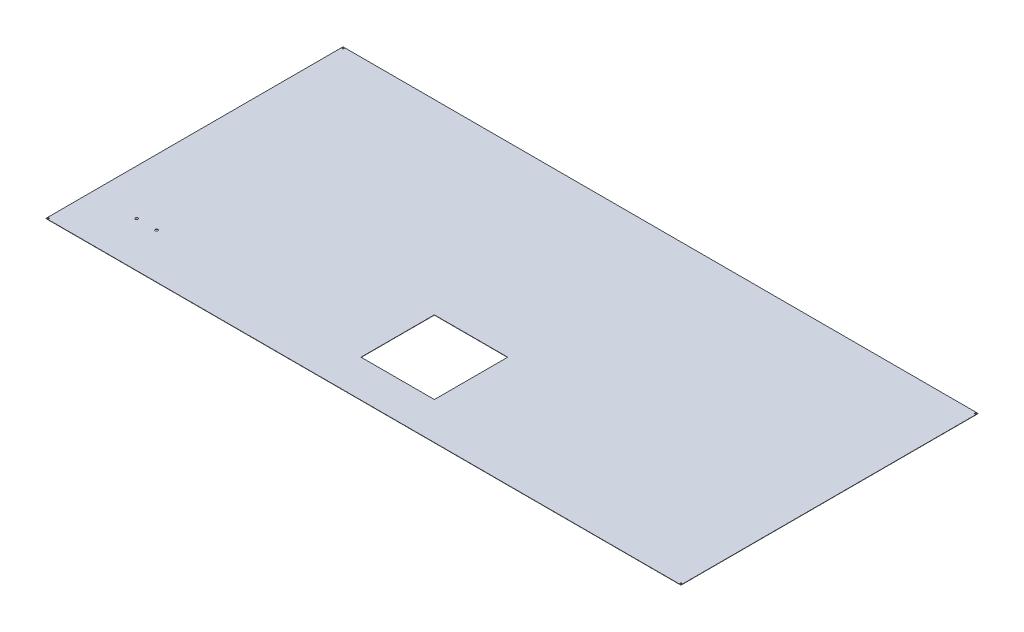
ISO-10303-21;
HEADER;
FILE_DESCRIPTION(('STEP AP214'),'2;1');
FILE_NAME('part.step','',(''),(''),'','','');
FILE_SCHEMA(('AUTOMOTIVE_DESIGN { 1 0 10303 214 1 1 1 1 }'));
ENDSEC;
DATA;
#1=APPLICATION_CONTEXT('core data for automotive mechanical design processes');
#2=APPLICATION_PROTOCOL_DEFINITION('international standard','automotive_design',2000,#1);
#3=PRODUCT_CONTEXT('',#1,'mechanical');
#4=PRODUCT('Part','Part','',(#3));
#5=PRODUCT_RELATED_PRODUCT_CATEGORY('part','',(#4));
#6=PRODUCT_DEFINITION_FORMATION('','',#4);
#7=PRODUCT_DEFINITION_CONTEXT('part definition',#1,'design');
#8=PRODUCT_DEFINITION('design','',#6,#7);
#9=PRODUCT_DEFINITION_SHAPE('','',#8);
#10=(LENGTH_UNIT() NAMED_UNIT(*) SI_UNIT(.MILLI.,.METRE.));
#11=(NAMED_UNIT(*) PLANE_ANGLE_UNIT() SI_UNIT($,.RADIAN.));
#12=(NAMED_UNIT(*) SI_UNIT($,.STERADIAN.) SOLID_ANGLE_UNIT());
#13=UNCERTAINTY_MEASURE_WITH_UNIT(LENGTH_MEASURE(1.E-05),#10,'distance_accuracy_value','');
#14=(GEOMETRIC_REPRESENTATION_CONTEXT(3) GLOBAL_UNCERTAINTY_ASSIGNED_CONTEXT((#13)) GLOBAL_UNIT_ASSIGNED_CONTEXT((#10,
#11,#12)) REPRESENTATION_CONTEXT('',''));
#15=CARTESIAN_POINT('',(0.,0.,0.));
#16=DIRECTION('',(0.,0.,1.));
#17=DIRECTION('',(1.,0.,0.));
#18=AXIS2_PLACEMENT_3D('',#15,#16,#17);
#19=CARTESIAN_POINT('',(689.999999996567,0.499999999999945,-1012.5));
#20=DIRECTION('',(1.,0.,0.));
#21=DIRECTION('',(0.,0.,-1.));
#22=AXIS2_PLACEMENT_3D('',#19,#20,#21);
#23=PLANE('',#22);
#24=DIRECTION('',(0.,0.,1.));
#25=VECTOR('',#24,1.);
#26=CARTESIAN_POINT('',(689.999999996567,0.,-1012.5));
#27=LINE('',#26,#25);
#28=CARTESIAN_POINT('',(689.999999996568,0.,-1579.5));
#29=VERTEX_POINT('',#28);
#30=CARTESIAN_POINT('',(689.999999996567,0.,-1012.5));
#31=VERTEX_POINT('',#30);
#32=EDGE_CURVE('E166',#29,#31,#27,.T.);
#33=ORIENTED_EDGE('',*,*,#32,.T.);
#34=DIRECTION('',(0.,-1.,0.));
#35=VECTOR('',#34,1.);
#36=CARTESIAN_POINT('',(689.999999996567,0.499999999999945,-1012.5));
#37=LINE('',#36,#35);
#38=CARTESIAN_POINT('',(689.999999996567,0.499999999999945,-1012.5));
#39=VERTEX_POINT('',#38);
#40=EDGE_CURVE('E182',#39,#31,#37,.T.);
#41=ORIENTED_EDGE('',*,*,#40,.F.);
#42=DIRECTION('',(0.,0.,1.));
#43=VECTOR('',#42,1.);
#44=CARTESIAN_POINT('',(689.999999996567,0.499999999999945,-1012.5));
#45=LINE('',#44,#43);
#46=CARTESIAN_POINT('',(689.999999996568,0.499999999999945,-1579.5));
#47=VERTEX_POINT('',#46);
#48=EDGE_CURVE('E155',#47,#39,#45,.T.);
#49=ORIENTED_EDGE('',*,*,#48,.F.);
#50=DIRECTION('',(0.,-1.,0.));
#51=VECTOR('',#50,1.);
#52=CARTESIAN_POINT('',(689.999999996568,0.499999999999945,-1579.5));
#53=LINE('',#52,#51);
#54=EDGE_CURVE('E165',#47,#29,#53,.T.);
#55=ORIENTED_EDGE('',*,*,#54,.T.);
#56=EDGE_LOOP('',(#33,#41,#49,#55));
#57=FACE_BOUND('',#56,.T.);
#58=ADVANCED_FACE('F39',(#57),#23,.F.);
#59=CARTESIAN_POINT('',(1901.99999999657,0.499999999999945,-1012.5));
#60=DIRECTION('',(0.,0.,-1.));
#61=DIRECTION('',(-1.,0.,0.));
#62=AXIS2_PLACEMENT_3D('',#59,#60,#61);
#63=PLANE('',#62);
#64=DIRECTION('',(1.,0.,0.));
#65=VECTOR('',#64,1.);
#66=CARTESIAN_POINT('',(1901.99999999657,0.,-1012.5));
#67=LINE('',#66,#65);
#68=CARTESIAN_POINT('',(1901.99999999657,0.,-1012.5));
#69=VERTEX_POINT('',#68);
#70=EDGE_CURVE('E169',#31,#69,#67,.T.);
#71=ORIENTED_EDGE('',*,*,#70,.T.);
#72=DIRECTION('',(0.,-1.,0.));
#73=VECTOR('',#72,1.);
#74=CARTESIAN_POINT('',(1901.99999999657,0.499999999999945,-1012.5));
#75=LINE('',#74,#73);
#76=CARTESIAN_POINT('',(1901.99999999657,0.499999999999945,-1012.5));
#77=VERTEX_POINT('',#76);
#78=EDGE_CURVE('E179',#77,#69,#75,.T.);
#79=ORIENTED_EDGE('',*,*,#78,.F.);
#80=DIRECTION('',(1.,0.,0.));
#81=VECTOR('',#80,1.);
#82=CARTESIAN_POINT('',(1901.99999999657,0.499999999999945,-1012.5));
#83=LINE('',#82,#81);
#84=EDGE_CURVE('E158',#39,#77,#83,.T.);
#85=ORIENTED_EDGE('',*,*,#84,.F.);
#86=ORIENTED_EDGE('',*,*,#40,.T.);
#87=EDGE_LOOP('',(#71,#79,#85,#86));
#88=FACE_BOUND('',#87,.T.);
#89=ADVANCED_FACE('F221',(#88),#63,.F.);
#90=CARTESIAN_POINT('',(1901.99999999657,0.499999999999945,-1012.5));
#91=DIRECTION('',(-1.,0.,0.));
#92=DIRECTION('',(0.,0.,1.));
#93=AXIS2_PLACEMENT_3D('',#90,#91,#92);
#94=PLANE('',#93);
#95=DIRECTION('',(0.,0.,-1.));
#96=VECTOR('',#95,1.);
#97=CARTESIAN_POINT('',(1901.99999999657,0.,-1012.5));
#98=LINE('',#97,#96);
#99=CARTESIAN_POINT('',(1901.99999999657,0.,-1579.5));
#100=VERTEX_POINT('',#99);
#101=EDGE_CURVE('E171',#69,#100,#98,.T.);
#102=ORIENTED_EDGE('',*,*,#101,.T.);
#103=DIRECTION('',(0.,-1.,0.));
#104=VECTOR('',#103,1.);
#105=CARTESIAN_POINT('',(1901.99999999657,0.499999999999945,-1579.5));
#106=LINE('',#105,#104);
#107=CARTESIAN_POINT('',(1901.99999999657,0.499999999999945,-1579.5));
#108=VERTEX_POINT('',#107);
#109=EDGE_CURVE('E176',#108,#100,#106,.T.);
#110=ORIENTED_EDGE('',*,*,#109,.F.);
#111=DIRECTION('',(0.,0.,-1.));
#112=VECTOR('',#111,1.);
#113=CARTESIAN_POINT('',(1901.99999999657,0.499999999999945,-1012.5));
#114=LINE('',#113,#112);
#115=EDGE_CURVE('E161',#77,#108,#114,.T.);
#116=ORIENTED_EDGE('',*,*,#115,.F.);
#117=ORIENTED_EDGE('',*,*,#78,.T.);
#118=EDGE_LOOP('',(#102,#110,#116,#117));
#119=FACE_BOUND('',#118,.T.);
#120=ADVANCED_FACE('F227',(#119),#94,.F.);
#121=CARTESIAN_POINT('',(1901.99999999657,0.499999999999945,-1579.5));
#122=DIRECTION('',(0.,0.,1.));
#123=DIRECTION('',(1.,0.,0.));
#124=AXIS2_PLACEMENT_3D('',#121,#122,#123);
#125=PLANE('',#124);
#126=DIRECTION('',(-1.,0.,0.));
#127=VECTOR('',#126,1.);
#128=CARTESIAN_POINT('',(1901.99999999657,0.,-1579.5));
#129=LINE('',#128,#127);
#130=EDGE_CURVE('E159',#100,#29,#129,.T.);
#131=ORIENTED_EDGE('',*,*,#130,.T.);
#132=ORIENTED_EDGE('',*,*,#54,.F.);
#133=DIRECTION('',(-1.,0.,0.));
#134=VECTOR('',#133,1.);
#135=CARTESIAN_POINT('',(1901.99999999657,0.499999999999945,-1579.5));
#136=LINE('',#135,#134);
#137=EDGE_CURVE('E163',#108,#47,#136,.T.);
#138=ORIENTED_EDGE('',*,*,#137,.F.);
#139=ORIENTED_EDGE('',*,*,#109,.T.);
#140=EDGE_LOOP('',(#131,#132,#138,#139));
#141=FACE_BOUND('',#140,.T.);
#142=ADVANCED_FACE('F242',(#141),#125,.F.);
#143=CARTESIAN_POINT('',(0.,0.499999999999945,0.));
#144=DIRECTION('',(0.,1.,0.));
#145=DIRECTION('',(0.,0.,1.));
#146=AXIS2_PLACEMENT_3D('',#143,#144,#145);
#147=PLANE('',#146);
#148=DIRECTION('',(0.,0.,1.));
#149=VECTOR('',#148,1.);
#150=CARTESIAN_POINT('',(1220.24360836821,0.499999999999945,-1223.58));
#151=LINE('',#150,#149);
#152=CARTESIAN_POINT('',(1220.24360836821,0.499999999999945,-1223.58));
#153=VERTEX_POINT('',#152);
#154=CARTESIAN_POINT('',(1220.24360836821,0.499999999999945,-1083.58));
#155=VERTEX_POINT('',#154);
#156=EDGE_CURVE('E53',#153,#155,#151,.T.);
#157=ORIENTED_EDGE('',*,*,#156,.F.);
#158=DIRECTION('',(-1.,0.,0.));
#159=VECTOR('',#158,1.);
#160=CARTESIAN_POINT('',(1220.24360836821,0.499999999999945,-1223.58));
#161=LINE('',#160,#159);
#162=CARTESIAN_POINT('',(1360.24360836821,0.499999999999945,-1223.58));
#163=VERTEX_POINT('',#162);
#164=EDGE_CURVE('E122',#163,#153,#161,.T.);
#165=ORIENTED_EDGE('',*,*,#164,.F.);
#166=DIRECTION('',(0.,0.,-1.));
#167=VECTOR('',#166,1.);
#168=CARTESIAN_POINT('',(1360.24360836821,0.499999999999945,-1223.58));
#169=LINE('',#168,#167);
#170=CARTESIAN_POINT('',(1360.24360836821,0.499999999999945,-1083.58));
#171=VERTEX_POINT('',#170);
#172=EDGE_CURVE('E106',#171,#163,#169,.T.);
#173=ORIENTED_EDGE('',*,*,#172,.F.);
#174=DIRECTION('',(1.,0.,0.));
#175=VECTOR('',#174,1.);
#176=CARTESIAN_POINT('',(1220.24360836821,0.499999999999945,-1083.58));
#177=LINE('',#176,#175);
#178=EDGE_CURVE('E115',#155,#171,#177,.T.);
#179=ORIENTED_EDGE('',*,*,#178,.F.);
#180=EDGE_LOOP('',(#157,#165,#173,#179));
#181=FACE_BOUND('',#180,.T.);
#182=CARTESIAN_POINT('',(776.999999996553,0.499999999999945,-1098.50000000001));
#183=DIRECTION('',(0.,1.,0.));
#184=DIRECTION('',(0.,0.,1.));
#185=AXIS2_PLACEMENT_3D('',#182,#183,#184);
#186=CIRCLE('',#185,2.50000000000005);
#187=CARTESIAN_POINT('',(776.999999996553,0.499999999999945,-1096.00000000001));
#188=VERTEX_POINT('',#187);
#189=EDGE_CURVE('E132',#188,#188,#186,.T.);
#190=ORIENTED_EDGE('',*,*,#189,.F.);
#191=EDGE_LOOP('',(#190));
#192=FACE_BOUND('',#191,.T.);
#193=CARTESIAN_POINT('',(814.999999996553,0.499999999999945,-1098.50000000001));
#194=DIRECTION('',(0.,1.,0.));
#195=DIRECTION('',(0.,0.,1.));
#196=AXIS2_PLACEMENT_3D('',#193,#194,#195);
#197=CIRCLE('',#196,2.50000000000005);
#198=CARTESIAN_POINT('',(814.999999996553,0.499999999999945,-1096.00000000001));
#199=VERTEX_POINT('',#198);
#200=EDGE_CURVE('E129',#199,#199,#197,.T.);
#201=ORIENTED_EDGE('',*,*,#200,.F.);
#202=EDGE_LOOP('',(#201));
#203=FACE_BOUND('',#202,.T.);
#204=CARTESIAN_POINT('',(691.999999996568,0.499999999999945,-1577.5));
#205=DIRECTION('',(0.,1.,0.));
#206=DIRECTION('',(0.,0.,1.));
#207=AXIS2_PLACEMENT_3D('',#204,#205,#206);
#208=CIRCLE('',#207,1.80000000000002);
#209=CARTESIAN_POINT('',(691.999999996568,0.499999999999945,-1575.7));
#210=VERTEX_POINT('',#209);
#211=EDGE_CURVE('E138',#210,#210,#208,.T.);
#212=ORIENTED_EDGE('',*,*,#211,.F.);
#213=EDGE_LOOP('',(#212));
#214=FACE_BOUND('',#213,.T.);
#215=CARTESIAN_POINT('',(691.999999996568,0.499999999999945,-1014.5));
#216=DIRECTION('',(0.,1.,0.));
#217=DIRECTION('',(0.,0.,1.));
#218=AXIS2_PLACEMENT_3D('',#215,#216,#217);
#219=CIRCLE('',#218,1.80000000000002);
#220=CARTESIAN_POINT('',(691.999999996568,0.499999999999945,-1012.7));
#221=VERTEX_POINT('',#220);
#222=EDGE_CURVE('E143',#221,#221,#219,.T.);
#223=ORIENTED_EDGE('',*,*,#222,.F.);
#224=EDGE_LOOP('',(#223));
#225=FACE_BOUND('',#224,.T.);
#226=CARTESIAN_POINT('',(1899.99999999657,0.499999999999945,-1014.5));
#227=DIRECTION('',(0.,1.,0.));
#228=DIRECTION('',(0.,0.,1.));
#229=AXIS2_PLACEMENT_3D('',#226,#227,#228);
#230=CIRCLE('',#229,1.80000000000002);
#231=CARTESIAN_POINT('',(1899.99999999657,0.499999999999945,-1012.7));
#232=VERTEX_POINT('',#231);
#233=EDGE_CURVE('E147',#232,#232,#230,.T.);
#234=ORIENTED_EDGE('',*,*,#233,.F.);
#235=EDGE_LOOP('',(#234));
#236=FACE_BOUND('',#235,.T.);
#237=CARTESIAN_POINT('',(1899.99999999657,0.499999999999945,-1577.5));
#238=DIRECTION('',(0.,1.,0.));
#239=DIRECTION('',(0.,0.,1.));
#240=AXIS2_PLACEMENT_3D('',#237,#238,#239);
#241=CIRCLE('',#240,1.80000000000002);
#242=CARTESIAN_POINT('',(1899.99999999657,0.499999999999945,-1575.7));
#243=VERTEX_POINT('',#242);
#244=EDGE_CURVE('E151',#243,#243,#241,.T.);
#245=ORIENTED_EDGE('',*,*,#244,.F.);
#246=EDGE_LOOP('',(#245));
#247=FACE_BOUND('',#246,.T.);
#248=ORIENTED_EDGE('',*,*,#48,.T.);
#249=ORIENTED_EDGE('',*,*,#84,.T.);
#250=ORIENTED_EDGE('',*,*,#115,.T.);
#251=ORIENTED_EDGE('',*,*,#137,.T.);
#252=EDGE_LOOP('',(#248,#249,#250,#251));
#253=FACE_BOUND('',#252,.T.);
#254=ADVANCED_FACE('F119',(#181,#192,#203,#214,#225,#236,#247,#253),#147,.T.);
#255=CARTESIAN_POINT('',(0.,0.,0.));
#256=DIRECTION('',(0.,1.,0.));
#257=DIRECTION('',(0.,0.,1.));
#258=AXIS2_PLACEMENT_3D('',#255,#256,#257);
#259=PLANE('',#258);
#260=DIRECTION('',(-1.,0.,0.));
#261=VECTOR('',#260,1.);
#262=CARTESIAN_POINT('',(0.,0.,-1223.58));
#263=LINE('',#262,#261);
#264=CARTESIAN_POINT('',(1360.24360836821,0.,-1223.58));
#265=VERTEX_POINT('',#264);
#266=CARTESIAN_POINT('',(1220.24360836821,0.,-1223.58));
#267=VERTEX_POINT('',#266);
#268=EDGE_CURVE('E46',#265,#267,#263,.T.);
#269=ORIENTED_EDGE('',*,*,#268,.T.);
#270=DIRECTION('',(0.,0.,1.));
#271=VECTOR('',#270,1.);
#272=CARTESIAN_POINT('',(1220.24360836821,0.,0.));
#273=LINE('',#272,#271);
#274=CARTESIAN_POINT('',(1220.24360836821,0.,-1083.58));
#275=VERTEX_POINT('',#274);
#276=EDGE_CURVE('E11',#267,#275,#273,.T.);
#277=ORIENTED_EDGE('',*,*,#276,.T.);
#278=DIRECTION('',(1.,0.,0.));
#279=VECTOR('',#278,1.);
#280=CARTESIAN_POINT('',(0.,0.,-1083.58));
#281=LINE('',#280,#279);
#282=CARTESIAN_POINT('',(1360.24360836821,0.,-1083.58));
#283=VERTEX_POINT('',#282);
#284=EDGE_CURVE('E185',#275,#283,#281,.T.);
#285=ORIENTED_EDGE('',*,*,#284,.T.);
#286=DIRECTION('',(0.,0.,-1.));
#287=VECTOR('',#286,1.);
#288=CARTESIAN_POINT('',(1360.24360836821,0.,2.22044604925031E-12));
#289=LINE('',#288,#287);
#290=EDGE_CURVE('E109',#283,#265,#289,.T.);
#291=ORIENTED_EDGE('',*,*,#290,.T.);
#292=EDGE_LOOP('',(#269,#277,#285,#291));
#293=FACE_BOUND('',#292,.T.);
#294=CARTESIAN_POINT('',(776.999999996553,0.,-1098.50000000001));
#295=DIRECTION('',(0.,1.,0.));
#296=DIRECTION('',(0.,0.,1.));
#297=AXIS2_PLACEMENT_3D('',#294,#295,#296);
#298=CIRCLE('',#297,2.50000000000005);
#299=CARTESIAN_POINT('',(776.999999996553,0.,-1096.00000000001));
#300=VERTEX_POINT('',#299);
#301=EDGE_CURVE('E142',#300,#300,#298,.T.);
#302=ORIENTED_EDGE('',*,*,#301,.T.);
#303=EDGE_LOOP('',(#302));
#304=FACE_BOUND('',#303,.T.);
#305=CARTESIAN_POINT('',(814.999999996553,0.,-1098.50000000001));
#306=DIRECTION('',(0.,1.,0.));
#307=DIRECTION('',(0.,0.,1.));
#308=AXIS2_PLACEMENT_3D('',#305,#306,#307);
#309=CIRCLE('',#308,2.50000000000005);
#310=CARTESIAN_POINT('',(814.999999996553,0.,-1096.00000000001));
#311=VERTEX_POINT('',#310);
#312=EDGE_CURVE('E135',#311,#311,#309,.T.);
#313=ORIENTED_EDGE('',*,*,#312,.T.);
#314=EDGE_LOOP('',(#313));
#315=FACE_BOUND('',#314,.T.);
#316=CARTESIAN_POINT('',(691.999999996568,0.,-1577.5));
#317=DIRECTION('',(0.,1.,0.));
#318=DIRECTION('',(0.,0.,1.));
#319=AXIS2_PLACEMENT_3D('',#316,#317,#318);
#320=CIRCLE('',#319,1.30000000000002);
#321=CARTESIAN_POINT('',(691.999999996568,0.,-1576.2));
#322=VERTEX_POINT('',#321);
#323=EDGE_CURVE('E141',#322,#322,#320,.T.);
#324=ORIENTED_EDGE('',*,*,#323,.T.);
#325=EDGE_LOOP('',(#324));
#326=FACE_BOUND('',#325,.T.);
#327=CARTESIAN_POINT('',(691.999999996568,0.,-1014.5));
#328=DIRECTION('',(0.,1.,0.));
#329=DIRECTION('',(0.,0.,1.));
#330=AXIS2_PLACEMENT_3D('',#327,#328,#329);
#331=CIRCLE('',#330,1.30000000000002);
#332=CARTESIAN_POINT('',(691.999999996568,0.,-1013.2));
#333=VERTEX_POINT('',#332);
#334=EDGE_CURVE('E146',#333,#333,#331,.T.);
#335=ORIENTED_EDGE('',*,*,#334,.T.);
#336=EDGE_LOOP('',(#335));
#337=FACE_BOUND('',#336,.T.);
#338=CARTESIAN_POINT('',(1899.99999999657,0.,-1014.5));
#339=DIRECTION('',(0.,1.,0.));
#340=DIRECTION('',(0.,0.,1.));
#341=AXIS2_PLACEMENT_3D('',#338,#339,#340);
#342=CIRCLE('',#341,1.29999999999996);
#343=CARTESIAN_POINT('',(1899.99999999657,0.,-1013.2));
#344=VERTEX_POINT('',#343);
#345=EDGE_CURVE('E150',#344,#344,#342,.T.);
#346=ORIENTED_EDGE('',*,*,#345,.T.);
#347=EDGE_LOOP('',(#346));
#348=FACE_BOUND('',#347,.T.);
#349=CARTESIAN_POINT('',(1899.99999999657,0.,-1577.5));
#350=DIRECTION('',(0.,1.,0.));
#351=DIRECTION('',(0.,0.,1.));
#352=AXIS2_PLACEMENT_3D('',#349,#350,#351);
#353=CIRCLE('',#352,1.29999999999996);
#354=CARTESIAN_POINT('',(1899.99999999657,0.,-1576.2));
#355=VERTEX_POINT('',#354);
#356=EDGE_CURVE('E154',#355,#355,#353,.T.);
#357=ORIENTED_EDGE('',*,*,#356,.T.);
#358=EDGE_LOOP('',(#357));
#359=FACE_BOUND('',#358,.T.);
#360=ORIENTED_EDGE('',*,*,#32,.F.);
#361=ORIENTED_EDGE('',*,*,#130,.F.);
#362=ORIENTED_EDGE('',*,*,#101,.F.);
#363=ORIENTED_EDGE('',*,*,#70,.F.);
#364=EDGE_LOOP('',(#360,#361,#362,#363));
#365=FACE_BOUND('',#364,.T.);
#366=ADVANCED_FACE('F201',(#293,#304,#315,#326,#337,#348,#359,#365),#259,.F.);
#367=CARTESIAN_POINT('',(1899.99999999657,0.499999999999945,-1577.5));
#368=DIRECTION('',(0.,1.,0.));
#369=DIRECTION('',(0.,0.,1.));
#370=AXIS2_PLACEMENT_3D('',#367,#368,#369);
#371=CONICAL_SURFACE('',#370,1.80000000000002,0.785398163397514);
#372=ORIENTED_EDGE('',*,*,#244,.T.);
#373=EDGE_LOOP('',(#372));
#374=FACE_BOUND('',#373,.T.);
#375=ORIENTED_EDGE('',*,*,#356,.F.);
#376=EDGE_LOOP('',(#375));
#377=FACE_BOUND('',#376,.T.);
#378=ADVANCED_FACE('F254',(#374,#377),#371,.F.);
#379=CARTESIAN_POINT('',(1899.99999999657,0.499999999999945,-1014.5));
#380=DIRECTION('',(0.,1.,0.));
#381=DIRECTION('',(0.,0.,1.));
#382=AXIS2_PLACEMENT_3D('',#379,#380,#381);
#383=CONICAL_SURFACE('',#382,1.80000000000002,0.785398163397514);
#384=ORIENTED_EDGE('',*,*,#233,.T.);
#385=EDGE_LOOP('',(#384));
#386=FACE_BOUND('',#385,.T.);
#387=ORIENTED_EDGE('',*,*,#345,.F.);
#388=EDGE_LOOP('',(#387));
#389=FACE_BOUND('',#388,.T.);
#390=ADVANCED_FACE('F259',(#386,#389),#383,.F.);
#391=CARTESIAN_POINT('',(691.999999996568,0.499999999999945,-1014.5));
#392=DIRECTION('',(0.,1.,0.));
#393=DIRECTION('',(0.,0.,1.));
#394=AXIS2_PLACEMENT_3D('',#391,#392,#393);
#395=CONICAL_SURFACE('',#394,1.80000000000002,0.785398163397452);
#396=ORIENTED_EDGE('',*,*,#222,.T.);
#397=EDGE_LOOP('',(#396));
#398=FACE_BOUND('',#397,.T.);
#399=ORIENTED_EDGE('',*,*,#334,.F.);
#400=EDGE_LOOP('',(#399));
#401=FACE_BOUND('',#400,.T.);
#402=ADVANCED_FACE('F263',(#398,#401),#395,.F.);
#403=CARTESIAN_POINT('',(691.999999996568,0.499999999999945,-1577.5));
#404=DIRECTION('',(0.,1.,0.));
#405=DIRECTION('',(0.,0.,1.));
#406=AXIS2_PLACEMENT_3D('',#403,#404,#405);
#407=CONICAL_SURFACE('',#406,1.80000000000002,0.785398163397452);
#408=ORIENTED_EDGE('',*,*,#211,.T.);
#409=EDGE_LOOP('',(#408));
#410=FACE_BOUND('',#409,.T.);
#411=ORIENTED_EDGE('',*,*,#323,.F.);
#412=EDGE_LOOP('',(#411));
#413=FACE_BOUND('',#412,.T.);
#414=ADVANCED_FACE('F267',(#410,#413),#407,.F.);
#415=CARTESIAN_POINT('',(814.999999996553,-2.49999999999995,-1098.50000000001));
#416=DIRECTION('',(0.,1.,0.));
#417=DIRECTION('',(0.,0.,1.));
#418=AXIS2_PLACEMENT_3D('',#415,#416,#417);
#419=CYLINDRICAL_SURFACE('',#418,2.50000000000005);
#420=ORIENTED_EDGE('',*,*,#200,.T.);
#421=EDGE_LOOP('',(#420));
#422=FACE_BOUND('',#421,.T.);
#423=ORIENTED_EDGE('',*,*,#312,.F.);
#424=EDGE_LOOP('',(#423));
#425=FACE_BOUND('',#424,.T.);
#426=ADVANCED_FACE('F216',(#422,#425),#419,.F.);
#427=CARTESIAN_POINT('',(776.999999996553,-2.49999999999995,-1098.50000000001));
#428=DIRECTION('',(0.,1.,0.));
#429=DIRECTION('',(0.,0.,1.));
#430=AXIS2_PLACEMENT_3D('',#427,#428,#429);
#431=CYLINDRICAL_SURFACE('',#430,2.50000000000005);
#432=ORIENTED_EDGE('',*,*,#189,.T.);
#433=EDGE_LOOP('',(#432));
#434=FACE_BOUND('',#433,.T.);
#435=ORIENTED_EDGE('',*,*,#301,.F.);
#436=EDGE_LOOP('',(#435));
#437=FACE_BOUND('',#436,.T.);
#438=ADVANCED_FACE('F208',(#434,#437),#431,.F.);
#439=CARTESIAN_POINT('',(1220.24360836821,-6.49999999999995,-1223.58));
#440=DIRECTION('',(-1.,0.,0.));
#441=DIRECTION('',(0.,0.,1.));
#442=AXIS2_PLACEMENT_3D('',#439,#440,#441);
#443=PLANE('',#442);
#444=DIRECTION('',(0.,1.,0.));
#445=VECTOR('',#444,1.);
#446=CARTESIAN_POINT('',(1220.24360836821,-6.49999999999995,-1223.58));
#447=LINE('',#446,#445);
#448=EDGE_CURVE('E127',#267,#153,#447,.T.);
#449=ORIENTED_EDGE('',*,*,#448,.T.);
#450=ORIENTED_EDGE('',*,*,#156,.T.);
#451=DIRECTION('',(0.,1.,0.));
#452=VECTOR('',#451,1.);
#453=CARTESIAN_POINT('',(1220.24360836821,-6.49999999999995,-1083.58));
#454=LINE('',#453,#452);
#455=EDGE_CURVE('E112',#275,#155,#454,.T.);
#456=ORIENTED_EDGE('',*,*,#455,.F.);
#457=ORIENTED_EDGE('',*,*,#276,.F.);
#458=EDGE_LOOP('',(#449,#450,#456,#457));
#459=FACE_BOUND('',#458,.T.);
#460=ADVANCED_FACE('F206',(#459),#443,.F.);
#461=CARTESIAN_POINT('',(1220.24360836821,-6.49999999999995,-1223.58));
#462=DIRECTION('',(0.,0.,-1.));
#463=DIRECTION('',(-1.,0.,0.));
#464=AXIS2_PLACEMENT_3D('',#461,#462,#463);
#465=PLANE('',#464);
#466=DIRECTION('',(0.,1.,0.));
#467=VECTOR('',#466,1.);
#468=CARTESIAN_POINT('',(1360.24360836821,-6.49999999999995,-1223.58));
#469=LINE('',#468,#467);
#470=EDGE_CURVE('E111',#265,#163,#469,.T.);
#471=ORIENTED_EDGE('',*,*,#470,.T.);
#472=ORIENTED_EDGE('',*,*,#164,.T.);
#473=ORIENTED_EDGE('',*,*,#448,.F.);
#474=ORIENTED_EDGE('',*,*,#268,.F.);
#475=EDGE_LOOP('',(#471,#472,#473,#474));
#476=FACE_BOUND('',#475,.T.);
#477=ADVANCED_FACE('F205',(#476),#465,.F.);
#478=CARTESIAN_POINT('',(1360.24360836821,-6.49999999999995,-1223.58));
#479=DIRECTION('',(1.,0.,0.));
#480=DIRECTION('',(0.,0.,-1.));
#481=AXIS2_PLACEMENT_3D('',#478,#479,#480);
#482=PLANE('',#481);
#483=DIRECTION('',(0.,1.,0.));
#484=VECTOR('',#483,1.);
#485=CARTESIAN_POINT('',(1360.24360836821,-6.49999999999995,-1083.58));
#486=LINE('',#485,#484);
#487=EDGE_CURVE('E61',#283,#171,#486,.T.);
#488=ORIENTED_EDGE('',*,*,#487,.T.);
#489=ORIENTED_EDGE('',*,*,#172,.T.);
#490=ORIENTED_EDGE('',*,*,#470,.F.);
#491=ORIENTED_EDGE('',*,*,#290,.F.);
#492=EDGE_LOOP('',(#488,#489,#490,#491));
#493=FACE_BOUND('',#492,.T.);
#494=ADVANCED_FACE('F103',(#493),#482,.F.);
#495=CARTESIAN_POINT('',(1220.24360836821,-6.49999999999995,-1083.58));
#496=DIRECTION('',(0.,0.,1.));
#497=DIRECTION('',(1.,0.,0.));
#498=AXIS2_PLACEMENT_3D('',#495,#496,#497);
#499=PLANE('',#498);
#500=ORIENTED_EDGE('',*,*,#455,.T.);
#501=ORIENTED_EDGE('',*,*,#178,.T.);
#502=ORIENTED_EDGE('',*,*,#487,.F.);
#503=ORIENTED_EDGE('',*,*,#284,.F.);
#504=EDGE_LOOP('',(#500,#501,#502,#503));
#505=FACE_BOUND('',#504,.T.);
#506=ADVANCED_FACE('F116',(#505),#499,.F.);
#507=CLOSED_SHELL('',(#58,#89,#120,#142,#254,#366,#378,#390,#402,#414,#426,#438,#460,#477,#494,#506));
#508=MANIFOLD_SOLID_BREP('B2',#507);
#509=ADVANCED_BREP_SHAPE_REPRESENTATION('',(#18,#508),#14);
#510=SHAPE_DEFINITION_REPRESENTATION(#9,#509);
ENDSEC;
END-ISO-10303-21;
